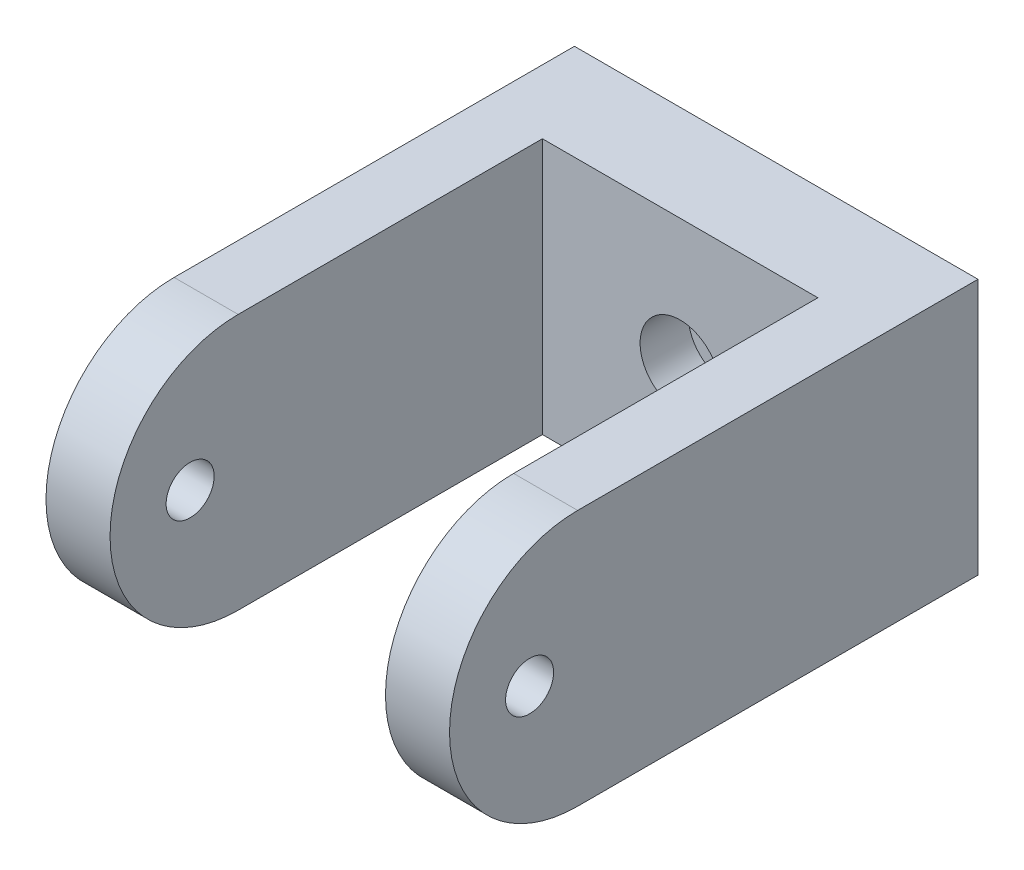
ISO-10303-21;
HEADER;
FILE_DESCRIPTION(('STEP AP214'),'2;1');
FILE_NAME('part.step','',(''),(''),'','','');
FILE_SCHEMA(('AUTOMOTIVE_DESIGN { 1 0 10303 214 1 1 1 1 }'));
ENDSEC;
DATA;
#1=APPLICATION_CONTEXT('core data for automotive mechanical design processes');
#2=APPLICATION_PROTOCOL_DEFINITION('international standard','automotive_design',2000,#1);
#3=PRODUCT_CONTEXT('',#1,'mechanical');
#4=PRODUCT('Part','Part','',(#3));
#5=PRODUCT_RELATED_PRODUCT_CATEGORY('part','',(#4));
#6=PRODUCT_DEFINITION_FORMATION('','',#4);
#7=PRODUCT_DEFINITION_CONTEXT('part definition',#1,'design');
#8=PRODUCT_DEFINITION('design','',#6,#7);
#9=PRODUCT_DEFINITION_SHAPE('','',#8);
#10=(LENGTH_UNIT() NAMED_UNIT(*) SI_UNIT(.MILLI.,.METRE.));
#11=(NAMED_UNIT(*) PLANE_ANGLE_UNIT() SI_UNIT($,.RADIAN.));
#12=(NAMED_UNIT(*) SI_UNIT($,.STERADIAN.) SOLID_ANGLE_UNIT());
#13=UNCERTAINTY_MEASURE_WITH_UNIT(LENGTH_MEASURE(1.E-05),#10,'distance_accuracy_value','');
#14=(GEOMETRIC_REPRESENTATION_CONTEXT(3) GLOBAL_UNCERTAINTY_ASSIGNED_CONTEXT((#13)) GLOBAL_UNIT_ASSIGNED_CONTEXT((#10,
#11,#12)) REPRESENTATION_CONTEXT('',''));
#15=CARTESIAN_POINT('',(0.,0.,0.));
#16=DIRECTION('',(0.,0.,1.));
#17=DIRECTION('',(1.,0.,0.));
#18=AXIS2_PLACEMENT_3D('',#15,#16,#17);
#19=CARTESIAN_POINT('',(-3.80326367559431,1.48884394342458,3.));
#20=DIRECTION('',(0.,-1.,0.));
#21=DIRECTION('',(0.,0.,-1.));
#22=AXIS2_PLACEMENT_3D('',#19,#20,#21);
#23=PLANE('',#22);
#24=DIRECTION('',(1.,0.,0.));
#25=VECTOR('',#24,1.);
#26=CARTESIAN_POINT('',(-30.,1.48884394342458,22.));
#27=LINE('',#26,#25);
#28=CARTESIAN_POINT('',(17.3967363244057,1.48884394342458,22.));
#29=VERTEX_POINT('',#28);
#30=CARTESIAN_POINT('',(21.3967363244057,1.48884394342458,22.));
#31=VERTEX_POINT('',#30);
#32=EDGE_CURVE('E58',#29,#31,#27,.T.);
#33=ORIENTED_EDGE('',*,*,#32,.T.);
#34=DIRECTION('',(0.,0.,-1.));
#35=VECTOR('',#34,1.);
#36=CARTESIAN_POINT('',(21.3967363244057,1.48884394342458,3.));
#37=LINE('',#36,#35);
#38=CARTESIAN_POINT('',(21.3967363244057,1.48884394342458,-3.));
#39=VERTEX_POINT('',#38);
#40=EDGE_CURVE('E119',#31,#39,#37,.T.);
#41=ORIENTED_EDGE('',*,*,#40,.T.);
#42=DIRECTION('',(-1.,0.,0.));
#43=VECTOR('',#42,1.);
#44=CARTESIAN_POINT('',(-3.80326367559431,1.48884394342458,-3.));
#45=LINE('',#44,#43);
#46=CARTESIAN_POINT('',(-3.80326367559431,1.48884394342458,-3.));
#47=VERTEX_POINT('',#46);
#48=EDGE_CURVE('E117',#39,#47,#45,.T.);
#49=ORIENTED_EDGE('',*,*,#48,.T.);
#50=DIRECTION('',(0.,0.,-1.));
#51=VECTOR('',#50,1.);
#52=CARTESIAN_POINT('',(-3.80326367559431,1.48884394342458,3.));
#53=LINE('',#52,#51);
#54=CARTESIAN_POINT('',(-3.80326367559431,1.48884394342458,22.));
#55=VERTEX_POINT('',#54);
#56=EDGE_CURVE('E103',#55,#47,#53,.T.);
#57=ORIENTED_EDGE('',*,*,#56,.F.);
#58=CARTESIAN_POINT('',(0.196736324405686,1.48884394342458,22.));
#59=VERTEX_POINT('',#58);
#60=EDGE_CURVE('E109',#55,#59,#27,.T.);
#61=ORIENTED_EDGE('',*,*,#60,.T.);
#62=DIRECTION('',(0.,0.,-1.));
#63=VECTOR('',#62,1.);
#64=CARTESIAN_POINT('',(0.196736324405686,1.48884394342458,30.));
#65=LINE('',#64,#63);
#66=CARTESIAN_POINT('',(0.196736324405686,1.48884394342458,3.));
#67=VERTEX_POINT('',#66);
#68=EDGE_CURVE('E168',#59,#67,#65,.T.);
#69=ORIENTED_EDGE('',*,*,#68,.T.);
#70=DIRECTION('',(-1.,0.,0.));
#71=VECTOR('',#70,1.);
#72=CARTESIAN_POINT('',(-3.80326367559431,1.48884394342458,3.));
#73=LINE('',#72,#71);
#74=CARTESIAN_POINT('',(17.3967363244057,1.48884394342458,3.));
#75=VERTEX_POINT('',#74);
#76=EDGE_CURVE('E120',#75,#67,#73,.T.);
#77=ORIENTED_EDGE('',*,*,#76,.F.);
#78=DIRECTION('',(0.,0.,-1.));
#79=VECTOR('',#78,1.);
#80=CARTESIAN_POINT('',(17.3967363244057,1.48884394342458,30.));
#81=LINE('',#80,#79);
#82=EDGE_CURVE('E163',#29,#75,#81,.T.);
#83=ORIENTED_EDGE('',*,*,#82,.F.);
#84=EDGE_LOOP('',(#33,#41,#49,#57,#61,#69,#77,#83));
#85=FACE_BOUND('',#84,.T.);
#86=ADVANCED_FACE('F33',(#85),#23,.F.);
#87=CARTESIAN_POINT('',(0.,0.,3.));
#88=DIRECTION('',(0.,0.,1.));
#89=DIRECTION('',(1.,0.,0.));
#90=AXIS2_PLACEMENT_3D('',#87,#88,#89);
#91=PLANE('',#90);
#92=CARTESIAN_POINT('',(8.79673632440569,-6.51115605657542,3.));
#93=DIRECTION('',(0.,0.,1.));
#94=DIRECTION('',(1.,0.,0.));
#95=AXIS2_PLACEMENT_3D('',#92,#93,#94);
#96=CIRCLE('',#95,2.5);
#97=CARTESIAN_POINT('',(11.2967363244057,-6.51115605657542,3.));
#98=VERTEX_POINT('',#97);
#99=EDGE_CURVE('E135',#98,#98,#96,.F.);
#100=ORIENTED_EDGE('',*,*,#99,.T.);
#101=EDGE_LOOP('',(#100));
#102=FACE_BOUND('',#101,.T.);
#103=DIRECTION('',(1.,0.,0.));
#104=VECTOR('',#103,1.);
#105=CARTESIAN_POINT('',(-3.80326367559431,-14.5111560565754,3.));
#106=LINE('',#105,#104);
#107=CARTESIAN_POINT('',(0.196736324405687,-14.5111560565754,3.));
#108=VERTEX_POINT('',#107);
#109=CARTESIAN_POINT('',(17.3967363244057,-14.5111560565754,3.));
#110=VERTEX_POINT('',#109);
#111=EDGE_CURVE('E125',#108,#110,#106,.T.);
#112=ORIENTED_EDGE('',*,*,#111,.T.);
#113=DIRECTION('',(0.,1.,0.));
#114=VECTOR('',#113,1.);
#115=CARTESIAN_POINT('',(17.3967363244057,0.,3.));
#116=LINE('',#115,#114);
#117=EDGE_CURVE('E165',#110,#75,#116,.T.);
#118=ORIENTED_EDGE('',*,*,#117,.T.);
#119=ORIENTED_EDGE('',*,*,#76,.T.);
#120=DIRECTION('',(0.,-1.,0.));
#121=VECTOR('',#120,1.);
#122=CARTESIAN_POINT('',(0.196736324405686,0.,3.));
#123=LINE('',#122,#121);
#124=EDGE_CURVE('E11',#67,#108,#123,.T.);
#125=ORIENTED_EDGE('',*,*,#124,.T.);
#126=EDGE_LOOP('',(#112,#118,#119,#125));
#127=FACE_BOUND('',#126,.T.);
#128=ADVANCED_FACE('F197',(#102,#127),#91,.T.);
#129=CARTESIAN_POINT('',(-3.80326367559431,1.48884394342458,3.));
#130=DIRECTION('',(1.,0.,0.));
#131=DIRECTION('',(0.,1.,0.));
#132=AXIS2_PLACEMENT_3D('',#129,#130,#131);
#133=PLANE('',#132);
#134=CARTESIAN_POINT('',(-3.80326367559431,-6.51115605657542,25.));
#135=DIRECTION('',(1.,0.,0.));
#136=DIRECTION('',(0.,1.,0.));
#137=AXIS2_PLACEMENT_3D('',#134,#135,#136);
#138=CIRCLE('',#137,1.5);
#139=CARTESIAN_POINT('',(-3.80326367559431,-5.01115605657542,25.));
#140=VERTEX_POINT('',#139);
#141=EDGE_CURVE('E153',#140,#140,#138,.T.);
#142=ORIENTED_EDGE('',*,*,#141,.T.);
#143=EDGE_LOOP('',(#142));
#144=FACE_BOUND('',#143,.T.);
#145=DIRECTION('',(0.,0.,-1.));
#146=VECTOR('',#145,1.);
#147=CARTESIAN_POINT('',(-3.80326367559431,-14.5111560565754,3.));
#148=LINE('',#147,#146);
#149=CARTESIAN_POINT('',(-3.80326367559431,-14.5111560565754,22.));
#150=VERTEX_POINT('',#149);
#151=CARTESIAN_POINT('',(-3.80326367559431,-14.5111560565754,-3.));
#152=VERTEX_POINT('',#151);
#153=EDGE_CURVE('E42',#150,#152,#148,.T.);
#154=ORIENTED_EDGE('',*,*,#153,.F.);
#155=CARTESIAN_POINT('',(-3.80326367559431,-6.51115605657542,22.));
#156=DIRECTION('',(1.,0.,0.));
#157=DIRECTION('',(0.,1.,0.));
#158=AXIS2_PLACEMENT_3D('',#155,#156,#157);
#159=CIRCLE('',#158,8.);
#160=EDGE_CURVE('E99',#150,#55,#159,.F.);
#161=ORIENTED_EDGE('',*,*,#160,.T.);
#162=ORIENTED_EDGE('',*,*,#56,.T.);
#163=DIRECTION('',(0.,-1.,0.));
#164=VECTOR('',#163,1.);
#165=CARTESIAN_POINT('',(-3.80326367559431,1.48884394342458,-3.));
#166=LINE('',#165,#164);
#167=EDGE_CURVE('E172',#47,#152,#166,.T.);
#168=ORIENTED_EDGE('',*,*,#167,.T.);
#169=EDGE_LOOP('',(#154,#161,#162,#168));
#170=FACE_BOUND('',#169,.T.);
#171=ADVANCED_FACE('F35',(#144,#170),#133,.F.);
#172=CARTESIAN_POINT('',(-3.80326367559431,-14.5111560565754,3.));
#173=DIRECTION('',(0.,1.,0.));
#174=DIRECTION('',(0.,0.,1.));
#175=AXIS2_PLACEMENT_3D('',#172,#173,#174);
#176=PLANE('',#175);
#177=DIRECTION('',(0.,0.,-1.));
#178=VECTOR('',#177,1.);
#179=CARTESIAN_POINT('',(21.3967363244057,-14.5111560565754,3.));
#180=LINE('',#179,#178);
#181=CARTESIAN_POINT('',(21.3967363244057,-14.5111560565754,22.));
#182=VERTEX_POINT('',#181);
#183=CARTESIAN_POINT('',(21.3967363244057,-14.5111560565754,-3.));
#184=VERTEX_POINT('',#183);
#185=EDGE_CURVE('E122',#182,#184,#180,.T.);
#186=ORIENTED_EDGE('',*,*,#185,.F.);
#187=DIRECTION('',(1.,0.,0.));
#188=VECTOR('',#187,1.);
#189=CARTESIAN_POINT('',(-30.,-14.5111560565754,22.));
#190=LINE('',#189,#188);
#191=CARTESIAN_POINT('',(17.3967363244057,-14.5111560565754,22.));
#192=VERTEX_POINT('',#191);
#193=EDGE_CURVE('E114',#192,#182,#190,.T.);
#194=ORIENTED_EDGE('',*,*,#193,.F.);
#195=DIRECTION('',(0.,0.,-1.));
#196=VECTOR('',#195,1.);
#197=CARTESIAN_POINT('',(17.3967363244057,-14.5111560565754,30.));
#198=LINE('',#197,#196);
#199=EDGE_CURVE('E105',#192,#110,#198,.T.);
#200=ORIENTED_EDGE('',*,*,#199,.T.);
#201=ORIENTED_EDGE('',*,*,#111,.F.);
#202=DIRECTION('',(0.,0.,-1.));
#203=VECTOR('',#202,1.);
#204=CARTESIAN_POINT('',(0.196736324405688,-14.5111560565754,30.));
#205=LINE('',#204,#203);
#206=CARTESIAN_POINT('',(0.196736324405688,-14.5111560565754,22.));
#207=VERTEX_POINT('',#206);
#208=EDGE_CURVE('E170',#207,#108,#205,.T.);
#209=ORIENTED_EDGE('',*,*,#208,.F.);
#210=EDGE_CURVE('E50',#150,#207,#190,.T.);
#211=ORIENTED_EDGE('',*,*,#210,.F.);
#212=ORIENTED_EDGE('',*,*,#153,.T.);
#213=DIRECTION('',(1.,0.,0.));
#214=VECTOR('',#213,1.);
#215=CARTESIAN_POINT('',(-3.80326367559431,-14.5111560565754,-3.));
#216=LINE('',#215,#214);
#217=EDGE_CURVE('E176',#152,#184,#216,.T.);
#218=ORIENTED_EDGE('',*,*,#217,.T.);
#219=EDGE_LOOP('',(#186,#194,#200,#201,#209,#211,#212,#218));
#220=FACE_BOUND('',#219,.T.);
#221=ADVANCED_FACE('F189',(#220),#176,.F.);
#222=CARTESIAN_POINT('',(21.3967363244057,1.48884394342458,3.));
#223=DIRECTION('',(-1.,0.,0.));
#224=DIRECTION('',(0.,-1.,0.));
#225=AXIS2_PLACEMENT_3D('',#222,#223,#224);
#226=PLANE('',#225);
#227=CARTESIAN_POINT('',(21.3967363244057,-6.51115605657542,25.));
#228=DIRECTION('',(-1.,0.,0.));
#229=DIRECTION('',(0.,-1.,0.));
#230=AXIS2_PLACEMENT_3D('',#227,#228,#229);
#231=CIRCLE('',#230,1.5);
#232=CARTESIAN_POINT('',(21.3967363244057,-8.01115605657542,25.));
#233=VERTEX_POINT('',#232);
#234=EDGE_CURVE('E150',#233,#233,#231,.T.);
#235=ORIENTED_EDGE('',*,*,#234,.T.);
#236=EDGE_LOOP('',(#235));
#237=FACE_BOUND('',#236,.T.);
#238=ORIENTED_EDGE('',*,*,#40,.F.);
#239=CARTESIAN_POINT('',(21.3967363244057,-6.51115605657542,22.));
#240=DIRECTION('',(-1.,0.,0.));
#241=DIRECTION('',(0.,-1.,0.));
#242=AXIS2_PLACEMENT_3D('',#239,#240,#241);
#243=CIRCLE('',#242,8.);
#244=EDGE_CURVE('E106',#31,#182,#243,.F.);
#245=ORIENTED_EDGE('',*,*,#244,.T.);
#246=ORIENTED_EDGE('',*,*,#185,.T.);
#247=DIRECTION('',(0.,1.,0.));
#248=VECTOR('',#247,1.);
#249=CARTESIAN_POINT('',(21.3967363244057,1.48884394342458,-3.));
#250=LINE('',#249,#248);
#251=EDGE_CURVE('E178',#184,#39,#250,.T.);
#252=ORIENTED_EDGE('',*,*,#251,.T.);
#253=EDGE_LOOP('',(#238,#245,#246,#252));
#254=FACE_BOUND('',#253,.T.);
#255=ADVANCED_FACE('F183',(#237,#254),#226,.F.);
#256=CARTESIAN_POINT('',(0.,0.,-3.));
#257=DIRECTION('',(0.,0.,1.));
#258=DIRECTION('',(1.,0.,0.));
#259=AXIS2_PLACEMENT_3D('',#256,#257,#258);
#260=PLANE('',#259);
#261=CARTESIAN_POINT('',(8.79673632440569,-6.51115605657542,-3.));
#262=DIRECTION('',(0.,0.,1.));
#263=DIRECTION('',(1.,0.,0.));
#264=AXIS2_PLACEMENT_3D('',#261,#262,#263);
#265=CIRCLE('',#264,1.);
#266=CARTESIAN_POINT('',(9.79673632440569,-6.51115605657542,-3.));
#267=VERTEX_POINT('',#266);
#268=EDGE_CURVE('E37',#267,#267,#265,.T.);
#269=ORIENTED_EDGE('',*,*,#268,.T.);
#270=EDGE_LOOP('',(#269));
#271=FACE_BOUND('',#270,.T.);
#272=ORIENTED_EDGE('',*,*,#167,.F.);
#273=ORIENTED_EDGE('',*,*,#48,.F.);
#274=ORIENTED_EDGE('',*,*,#251,.F.);
#275=ORIENTED_EDGE('',*,*,#217,.F.);
#276=EDGE_LOOP('',(#272,#273,#274,#275));
#277=FACE_BOUND('',#276,.T.);
#278=ADVANCED_FACE('F187',(#271,#277),#260,.F.);
#279=CARTESIAN_POINT('',(0.196736324405686,1.48884394342458,30.));
#280=DIRECTION('',(-1.,0.,0.));
#281=DIRECTION('',(0.,-1.,0.));
#282=AXIS2_PLACEMENT_3D('',#279,#280,#281);
#283=PLANE('',#282);
#284=CARTESIAN_POINT('',(0.196736324405686,-6.51115605657542,25.));
#285=DIRECTION('',(-1.,0.,0.));
#286=DIRECTION('',(0.,-1.,0.));
#287=AXIS2_PLACEMENT_3D('',#284,#285,#286);
#288=CIRCLE('',#287,1.5);
#289=CARTESIAN_POINT('',(0.196736324405686,-8.01115605657542,25.));
#290=VERTEX_POINT('',#289);
#291=EDGE_CURVE('E134',#290,#290,#288,.T.);
#292=ORIENTED_EDGE('',*,*,#291,.T.);
#293=EDGE_LOOP('',(#292));
#294=FACE_BOUND('',#293,.T.);
#295=ORIENTED_EDGE('',*,*,#68,.F.);
#296=CARTESIAN_POINT('',(0.196736324405686,-6.51115605657542,22.));
#297=DIRECTION('',(-1.,0.,0.));
#298=DIRECTION('',(0.,-1.,0.));
#299=AXIS2_PLACEMENT_3D('',#296,#297,#298);
#300=CIRCLE('',#299,8.);
#301=EDGE_CURVE('E111',#59,#207,#300,.F.);
#302=ORIENTED_EDGE('',*,*,#301,.T.);
#303=ORIENTED_EDGE('',*,*,#208,.T.);
#304=ORIENTED_EDGE('',*,*,#124,.F.);
#305=EDGE_LOOP('',(#295,#302,#303,#304));
#306=FACE_BOUND('',#305,.T.);
#307=ADVANCED_FACE('F195',(#294,#306),#283,.F.);
#308=CARTESIAN_POINT('',(17.3967363244057,1.48884394342458,30.));
#309=DIRECTION('',(1.,0.,0.));
#310=DIRECTION('',(0.,1.,0.));
#311=AXIS2_PLACEMENT_3D('',#308,#309,#310);
#312=PLANE('',#311);
#313=CARTESIAN_POINT('',(17.3967363244057,-6.51115605657542,25.));
#314=DIRECTION('',(1.,0.,0.));
#315=DIRECTION('',(0.,1.,0.));
#316=AXIS2_PLACEMENT_3D('',#313,#314,#315);
#317=CIRCLE('',#316,1.5);
#318=CARTESIAN_POINT('',(17.3967363244057,-5.01115605657542,25.));
#319=VERTEX_POINT('',#318);
#320=EDGE_CURVE('E132',#319,#319,#317,.T.);
#321=ORIENTED_EDGE('',*,*,#320,.T.);
#322=EDGE_LOOP('',(#321));
#323=FACE_BOUND('',#322,.T.);
#324=ORIENTED_EDGE('',*,*,#199,.F.);
#325=CARTESIAN_POINT('',(17.3967363244057,-6.51115605657542,22.));
#326=DIRECTION('',(1.,0.,0.));
#327=DIRECTION('',(0.,1.,0.));
#328=AXIS2_PLACEMENT_3D('',#325,#326,#327);
#329=CIRCLE('',#328,8.);
#330=EDGE_CURVE('E158',#192,#29,#329,.F.);
#331=ORIENTED_EDGE('',*,*,#330,.T.);
#332=ORIENTED_EDGE('',*,*,#82,.T.);
#333=ORIENTED_EDGE('',*,*,#117,.F.);
#334=EDGE_LOOP('',(#324,#331,#332,#333));
#335=FACE_BOUND('',#334,.T.);
#336=ADVANCED_FACE('F203',(#323,#335),#312,.F.);
#337=CARTESIAN_POINT('',(-30.,-6.51115605657542,22.));
#338=DIRECTION('',(1.,0.,0.));
#339=DIRECTION('',(0.,0.,-1.));
#340=AXIS2_PLACEMENT_3D('',#337,#338,#339);
#341=CYLINDRICAL_SURFACE('',#340,8.);
#342=ORIENTED_EDGE('',*,*,#32,.F.);
#343=ORIENTED_EDGE('',*,*,#330,.F.);
#344=ORIENTED_EDGE('',*,*,#193,.T.);
#345=ORIENTED_EDGE('',*,*,#244,.F.);
#346=EDGE_LOOP('',(#342,#343,#344,#345));
#347=FACE_BOUND('',#346,.T.);
#348=ADVANCED_FACE('F204',(#347),#341,.T.);
#349=ORIENTED_EDGE('',*,*,#210,.T.);
#350=ORIENTED_EDGE('',*,*,#301,.F.);
#351=ORIENTED_EDGE('',*,*,#60,.F.);
#352=ORIENTED_EDGE('',*,*,#160,.F.);
#353=EDGE_LOOP('',(#349,#350,#351,#352));
#354=FACE_BOUND('',#353,.T.);
#355=ADVANCED_FACE('F110',(#354),#341,.T.);
#356=CARTESIAN_POINT('',(-30.,-6.51115605657542,25.));
#357=DIRECTION('',(1.,0.,0.));
#358=DIRECTION('',(0.,0.,-1.));
#359=AXIS2_PLACEMENT_3D('',#356,#357,#358);
#360=CYLINDRICAL_SURFACE('',#359,1.5);
#361=ORIENTED_EDGE('',*,*,#320,.F.);
#362=EDGE_LOOP('',(#361));
#363=FACE_BOUND('',#362,.T.);
#364=ORIENTED_EDGE('',*,*,#234,.F.);
#365=EDGE_LOOP('',(#364));
#366=FACE_BOUND('',#365,.T.);
#367=ADVANCED_FACE('F211',(#363,#366),#360,.F.);
#368=ORIENTED_EDGE('',*,*,#291,.F.);
#369=EDGE_LOOP('',(#368));
#370=FACE_BOUND('',#369,.T.);
#371=ORIENTED_EDGE('',*,*,#141,.F.);
#372=EDGE_LOOP('',(#371));
#373=FACE_BOUND('',#372,.T.);
#374=ADVANCED_FACE('F234',(#370,#373),#360,.F.);
#375=CARTESIAN_POINT('',(8.79673632440569,-6.51115605657542,4.));
#376=DIRECTION('',(0.,0.,-1.));
#377=DIRECTION('',(-1.,0.,0.));
#378=AXIS2_PLACEMENT_3D('',#375,#376,#377);
#379=CYLINDRICAL_SURFACE('',#378,2.5);
#380=ORIENTED_EDGE('',*,*,#99,.F.);
#381=EDGE_LOOP('',(#380));
#382=FACE_BOUND('',#381,.T.);
#383=CARTESIAN_POINT('',(8.79673632440569,-6.51115605657542,0.));
#384=DIRECTION('',(0.,0.,1.));
#385=DIRECTION('',(1.,0.,0.));
#386=AXIS2_PLACEMENT_3D('',#383,#384,#385);
#387=CIRCLE('',#386,2.5);
#388=CARTESIAN_POINT('',(11.2967363244057,-6.51115605657542,0.));
#389=VERTEX_POINT('',#388);
#390=EDGE_CURVE('E137',#389,#389,#387,.T.);
#391=ORIENTED_EDGE('',*,*,#390,.F.);
#392=EDGE_LOOP('',(#391));
#393=FACE_BOUND('',#392,.T.);
#394=ADVANCED_FACE('F236',(#382,#393),#379,.F.);
#395=CARTESIAN_POINT('',(8.79673632440569,-6.51115605657542,0.));
#396=DIRECTION('',(0.,0.,1.));
#397=DIRECTION('',(1.,0.,0.));
#398=AXIS2_PLACEMENT_3D('',#395,#396,#397);
#399=PLANE('',#398);
#400=CARTESIAN_POINT('',(8.79673632440569,-6.51115605657542,0.));
#401=DIRECTION('',(0.,0.,1.));
#402=DIRECTION('',(1.,0.,0.));
#403=AXIS2_PLACEMENT_3D('',#400,#401,#402);
#404=CIRCLE('',#403,1.);
#405=CARTESIAN_POINT('',(9.79673632440569,-6.51115605657542,0.));
#406=VERTEX_POINT('',#405);
#407=EDGE_CURVE('E145',#406,#406,#404,.T.);
#408=ORIENTED_EDGE('',*,*,#407,.F.);
#409=EDGE_LOOP('',(#408));
#410=FACE_BOUND('',#409,.T.);
#411=ORIENTED_EDGE('',*,*,#390,.T.);
#412=EDGE_LOOP('',(#411));
#413=FACE_BOUND('',#412,.T.);
#414=ADVANCED_FACE('F242',(#410,#413),#399,.T.);
#415=CARTESIAN_POINT('',(8.79673632440569,-6.51115605657542,-15.));
#416=DIRECTION('',(0.,0.,1.));
#417=DIRECTION('',(1.,0.,0.));
#418=AXIS2_PLACEMENT_3D('',#415,#416,#417);
#419=CYLINDRICAL_SURFACE('',#418,1.);
#420=ORIENTED_EDGE('',*,*,#407,.T.);
#421=EDGE_LOOP('',(#420));
#422=FACE_BOUND('',#421,.T.);
#423=ORIENTED_EDGE('',*,*,#268,.F.);
#424=EDGE_LOOP('',(#423));
#425=FACE_BOUND('',#424,.T.);
#426=ADVANCED_FACE('F250',(#422,#425),#419,.F.);
#427=CLOSED_SHELL('',(#86,#128,#171,#221,#255,#278,#307,#336,#348,#355,#367,#374,#394,#414,#426));
#428=MANIFOLD_SOLID_BREP('B2',#427);
#429=ADVANCED_BREP_SHAPE_REPRESENTATION('',(#18,#428),#14);
#430=SHAPE_DEFINITION_REPRESENTATION(#9,#429);
ENDSEC;
END-ISO-10303-21;
